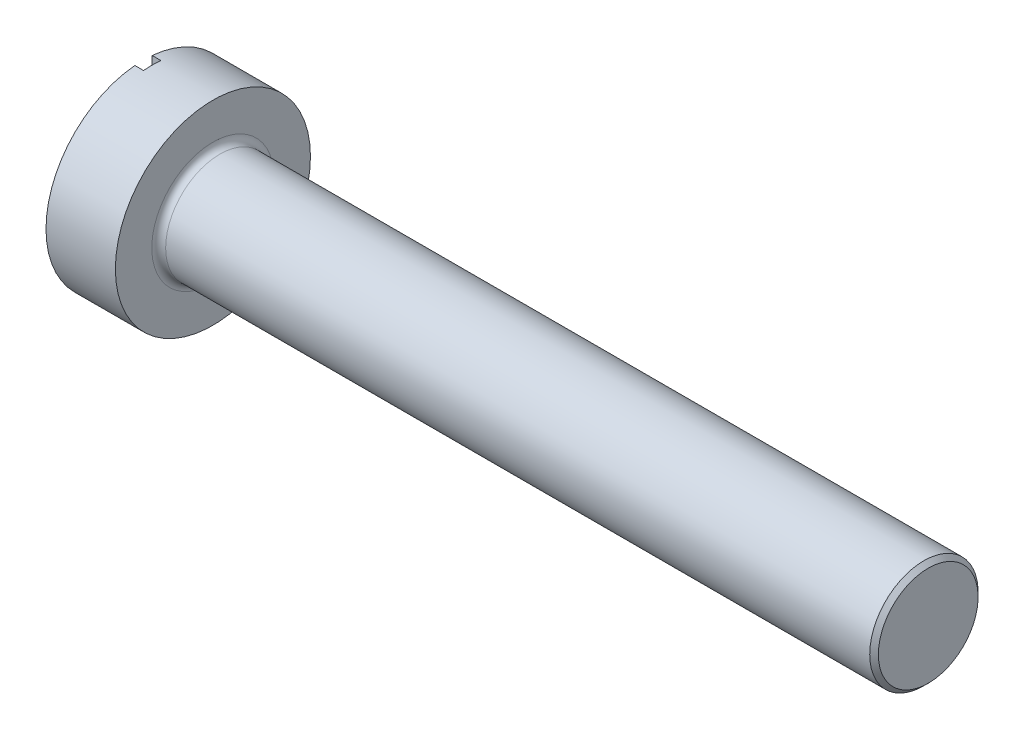
ISO-10303-21;
HEADER;
FILE_DESCRIPTION(('STEP AP214'),'2;1');
FILE_NAME('part.step','',(''),(''),'','','');
FILE_SCHEMA(('AUTOMOTIVE_DESIGN { 1 0 10303 214 1 1 1 1 }'));
ENDSEC;
DATA;
#1=APPLICATION_CONTEXT('core data for automotive mechanical design processes');
#2=APPLICATION_PROTOCOL_DEFINITION('international standard','automotive_design',2000,#1);
#3=PRODUCT_CONTEXT('',#1,'mechanical');
#4=PRODUCT('Part','Part','',(#3));
#5=PRODUCT_RELATED_PRODUCT_CATEGORY('part','',(#4));
#6=PRODUCT_DEFINITION_FORMATION('','',#4);
#7=PRODUCT_DEFINITION_CONTEXT('part definition',#1,'design');
#8=PRODUCT_DEFINITION('design','',#6,#7);
#9=PRODUCT_DEFINITION_SHAPE('','',#8);
#10=(LENGTH_UNIT() NAMED_UNIT(*) SI_UNIT(.MILLI.,.METRE.));
#11=(NAMED_UNIT(*) PLANE_ANGLE_UNIT() SI_UNIT($,.RADIAN.));
#12=(NAMED_UNIT(*) SI_UNIT($,.STERADIAN.) SOLID_ANGLE_UNIT());
#13=UNCERTAINTY_MEASURE_WITH_UNIT(LENGTH_MEASURE(1.E-05),#10,'distance_accuracy_value','');
#14=(GEOMETRIC_REPRESENTATION_CONTEXT(3) GLOBAL_UNCERTAINTY_ASSIGNED_CONTEXT((#13)) GLOBAL_UNIT_ASSIGNED_CONTEXT((#10,
#11,#12)) REPRESENTATION_CONTEXT('',''));
#15=CARTESIAN_POINT('',(0.,0.,0.));
#16=DIRECTION('',(0.,0.,1.));
#17=DIRECTION('',(1.,0.,0.));
#18=AXIS2_PLACEMENT_3D('',#15,#16,#17);
#19=CARTESIAN_POINT('',(0.,0.,0.));
#20=DIRECTION('',(-1.,0.,0.));
#21=DIRECTION('',(0.,0.,1.));
#22=AXIS2_PLACEMENT_3D('',#19,#20,#21);
#23=CYLINDRICAL_SURFACE('',#22,2.25);
#24=CARTESIAN_POINT('',(1.6,0.,0.));
#25=DIRECTION('',(-1.,0.,0.));
#26=DIRECTION('',(0.,0.,1.));
#27=AXIS2_PLACEMENT_3D('',#24,#25,#26);
#28=CIRCLE('',#27,2.25);
#29=CARTESIAN_POINT('',(1.6,0.,2.25));
#30=VERTEX_POINT('',#29);
#31=EDGE_CURVE('E92',#30,#30,#28,.T.);
#32=ORIENTED_EDGE('',*,*,#31,.T.);
#33=EDGE_LOOP('',(#32));
#34=FACE_BOUND('',#33,.T.);
#35=DIRECTION('',(-1.,0.,0.));
#36=VECTOR('',#35,1.);
#37=CARTESIAN_POINT('',(0.,-2.2410934831015,0.2));
#38=LINE('',#37,#36);
#39=CARTESIAN_POINT('',(0.2,-2.2410934831015,0.2));
#40=VERTEX_POINT('',#39);
#41=CARTESIAN_POINT('',(0.,-2.2410934831015,0.2));
#42=VERTEX_POINT('',#41);
#43=EDGE_CURVE('E122',#40,#42,#38,.T.);
#44=ORIENTED_EDGE('',*,*,#43,.F.);
#45=CARTESIAN_POINT('',(0.2,0.,0.));
#46=DIRECTION('',(-1.,0.,0.));
#47=DIRECTION('',(0.,0.,1.));
#48=AXIS2_PLACEMENT_3D('',#45,#46,#47);
#49=CIRCLE('',#48,2.25);
#50=CARTESIAN_POINT('',(0.2,-2.2410934831015,-0.2));
#51=VERTEX_POINT('',#50);
#52=EDGE_CURVE('E11',#40,#51,#49,.F.);
#53=ORIENTED_EDGE('',*,*,#52,.T.);
#54=DIRECTION('',(-1.,0.,0.));
#55=VECTOR('',#54,1.);
#56=CARTESIAN_POINT('',(0.,-2.2410934831015,-0.2));
#57=LINE('',#56,#55);
#58=CARTESIAN_POINT('',(0.,-2.2410934831015,-0.2));
#59=VERTEX_POINT('',#58);
#60=EDGE_CURVE('E79',#51,#59,#57,.T.);
#61=ORIENTED_EDGE('',*,*,#60,.T.);
#62=CARTESIAN_POINT('',(0.,0.,0.));
#63=DIRECTION('',(-1.,0.,0.));
#64=DIRECTION('',(0.,0.,1.));
#65=AXIS2_PLACEMENT_3D('',#62,#63,#64);
#66=CIRCLE('',#65,2.25);
#67=CARTESIAN_POINT('',(0.,2.2410934831015,-0.2));
#68=VERTEX_POINT('',#67);
#69=EDGE_CURVE('E88',#68,#59,#66,.T.);
#70=ORIENTED_EDGE('',*,*,#69,.F.);
#71=DIRECTION('',(-1.,0.,0.));
#72=VECTOR('',#71,1.);
#73=CARTESIAN_POINT('',(0.,2.2410934831015,-0.2));
#74=LINE('',#73,#72);
#75=CARTESIAN_POINT('',(0.2,2.2410934831015,-0.2));
#76=VERTEX_POINT('',#75);
#77=EDGE_CURVE('E52',#68,#76,#74,.F.);
#78=ORIENTED_EDGE('',*,*,#77,.T.);
#79=CARTESIAN_POINT('',(0.2,2.2410934831015,0.2));
#80=VERTEX_POINT('',#79);
#81=EDGE_CURVE('E41',#76,#80,#49,.F.);
#82=ORIENTED_EDGE('',*,*,#81,.T.);
#83=DIRECTION('',(-1.,0.,0.));
#84=VECTOR('',#83,1.);
#85=CARTESIAN_POINT('',(0.,2.2410934831015,0.2));
#86=LINE('',#85,#84);
#87=CARTESIAN_POINT('',(0.,2.2410934831015,0.2));
#88=VERTEX_POINT('',#87);
#89=EDGE_CURVE('E99',#88,#80,#86,.F.);
#90=ORIENTED_EDGE('',*,*,#89,.F.);
#91=EDGE_CURVE('E93',#42,#88,#66,.T.);
#92=ORIENTED_EDGE('',*,*,#91,.F.);
#93=EDGE_LOOP('',(#44,#53,#61,#70,#78,#82,#90,#92));
#94=FACE_BOUND('',#93,.T.);
#95=ADVANCED_FACE('F37',(#34,#94),#23,.T.);
#96=CARTESIAN_POINT('',(0.,0.,0.));
#97=DIRECTION('',(-1.,0.,0.));
#98=DIRECTION('',(0.,0.,1.));
#99=AXIS2_PLACEMENT_3D('',#96,#97,#98);
#100=PLANE('',#99);
#101=ORIENTED_EDGE('',*,*,#69,.T.);
#102=DIRECTION('',(0.,1.,0.));
#103=VECTOR('',#102,1.);
#104=CARTESIAN_POINT('',(0.,0.,-0.2));
#105=LINE('',#104,#103);
#106=EDGE_CURVE('E76',#59,#68,#105,.T.);
#107=ORIENTED_EDGE('',*,*,#106,.T.);
#108=EDGE_LOOP('',(#101,#107));
#109=FACE_BOUND('',#108,.T.);
#110=ADVANCED_FACE('F91',(#109),#100,.T.);
#111=CARTESIAN_POINT('',(18.1,0.,0.));
#112=DIRECTION('',(-1.,0.,0.));
#113=DIRECTION('',(0.,0.,1.));
#114=AXIS2_PLACEMENT_3D('',#111,#112,#113);
#115=PLANE('',#114);
#116=CARTESIAN_POINT('',(18.1,0.,0.));
#117=DIRECTION('',(-1.,0.,0.));
#118=DIRECTION('',(0.,0.,1.));
#119=AXIS2_PLACEMENT_3D('',#116,#117,#118);
#120=CIRCLE('',#119,1.14999999999999);
#121=CARTESIAN_POINT('',(18.1,0.,1.14999999999999));
#122=VERTEX_POINT('',#121);
#123=EDGE_CURVE('E105',#122,#122,#120,.F.);
#124=ORIENTED_EDGE('',*,*,#123,.T.);
#125=EDGE_LOOP('',(#124));
#126=FACE_BOUND('',#125,.T.);
#127=ADVANCED_FACE('F141',(#126),#115,.F.);
#128=CARTESIAN_POINT('',(0.,0.,0.));
#129=DIRECTION('',(-1.,0.,0.));
#130=DIRECTION('',(0.,0.,1.));
#131=AXIS2_PLACEMENT_3D('',#128,#129,#130);
#132=CYLINDRICAL_SURFACE('',#131,1.25);
#133=CARTESIAN_POINT('',(1.76,0.,0.));
#134=DIRECTION('',(1.,0.,0.));
#135=DIRECTION('',(0.,0.,-1.));
#136=AXIS2_PLACEMENT_3D('',#133,#134,#135);
#137=CIRCLE('',#136,1.25);
#138=CARTESIAN_POINT('',(1.76,0.,-1.25));
#139=VERTEX_POINT('',#138);
#140=EDGE_CURVE('E84',#139,#139,#137,.T.);
#141=ORIENTED_EDGE('',*,*,#140,.T.);
#142=EDGE_LOOP('',(#141));
#143=FACE_BOUND('',#142,.T.);
#144=CARTESIAN_POINT('',(18.,0.,0.));
#145=DIRECTION('',(-1.,0.,0.));
#146=DIRECTION('',(0.,0.,1.));
#147=AXIS2_PLACEMENT_3D('',#144,#145,#146);
#148=CIRCLE('',#147,1.25);
#149=CARTESIAN_POINT('',(18.,0.,1.25));
#150=VERTEX_POINT('',#149);
#151=EDGE_CURVE('E96',#150,#150,#148,.T.);
#152=ORIENTED_EDGE('',*,*,#151,.T.);
#153=EDGE_LOOP('',(#152));
#154=FACE_BOUND('',#153,.T.);
#155=ADVANCED_FACE('F135',(#143,#154),#132,.T.);
#156=CARTESIAN_POINT('',(1.6,0.,0.));
#157=DIRECTION('',(1.,0.,0.));
#158=DIRECTION('',(0.,0.,-1.));
#159=AXIS2_PLACEMENT_3D('',#156,#157,#158);
#160=PLANE('',#159);
#161=CARTESIAN_POINT('',(1.6,0.,0.));
#162=DIRECTION('',(1.,0.,0.));
#163=DIRECTION('',(0.,0.,-1.));
#164=AXIS2_PLACEMENT_3D('',#161,#162,#163);
#165=CIRCLE('',#164,1.41);
#166=CARTESIAN_POINT('',(1.6,0.,-1.41));
#167=VERTEX_POINT('',#166);
#168=EDGE_CURVE('E108',#167,#167,#165,.F.);
#169=ORIENTED_EDGE('',*,*,#168,.T.);
#170=EDGE_LOOP('',(#169));
#171=FACE_BOUND('',#170,.T.);
#172=ORIENTED_EDGE('',*,*,#31,.F.);
#173=EDGE_LOOP('',(#172));
#174=FACE_BOUND('',#173,.T.);
#175=ADVANCED_FACE('F128',(#171,#174),#160,.T.);
#176=DIRECTION('',(0.,1.,0.));
#177=VECTOR('',#176,1.);
#178=CARTESIAN_POINT('',(0.,0.,0.2));
#179=LINE('',#178,#177);
#180=EDGE_CURVE('E60',#42,#88,#179,.T.);
#181=ORIENTED_EDGE('',*,*,#180,.F.);
#182=ORIENTED_EDGE('',*,*,#91,.T.);
#183=EDGE_LOOP('',(#181,#182));
#184=FACE_BOUND('',#183,.T.);
#185=ADVANCED_FACE('F125',(#184),#100,.T.);
#186=CARTESIAN_POINT('',(18.,0.,0.));
#187=DIRECTION('',(-1.,0.,0.));
#188=DIRECTION('',(0.,0.,1.));
#189=AXIS2_PLACEMENT_3D('',#186,#187,#188);
#190=CONICAL_SURFACE('',#189,1.25,0.785398163397431);
#191=ORIENTED_EDGE('',*,*,#123,.F.);
#192=EDGE_LOOP('',(#191));
#193=FACE_BOUND('',#192,.T.);
#194=ORIENTED_EDGE('',*,*,#151,.F.);
#195=EDGE_LOOP('',(#194));
#196=FACE_BOUND('',#195,.T.);
#197=ADVANCED_FACE('F127',(#193,#196),#190,.T.);
#198=CARTESIAN_POINT('',(1.76,0.,0.));
#199=DIRECTION('',(1.,0.,0.));
#200=DIRECTION('',(0.,0.,-1.));
#201=AXIS2_PLACEMENT_3D('',#198,#199,#200);
#202=TOROIDAL_SURFACE('',#201,1.41,0.16);
#203=ORIENTED_EDGE('',*,*,#140,.F.);
#204=EDGE_LOOP('',(#203));
#205=FACE_BOUND('',#204,.T.);
#206=ORIENTED_EDGE('',*,*,#168,.F.);
#207=EDGE_LOOP('',(#206));
#208=FACE_BOUND('',#207,.T.);
#209=ADVANCED_FACE('F39',(#205,#208),#202,.F.);
#210=CARTESIAN_POINT('',(0.2,-2.25,0.));
#211=DIRECTION('',(-1.,0.,0.));
#212=DIRECTION('',(0.,0.,1.));
#213=AXIS2_PLACEMENT_3D('',#210,#211,#212);
#214=PLANE('',#213);
#215=DIRECTION('',(0.,1.,0.));
#216=VECTOR('',#215,1.);
#217=CARTESIAN_POINT('',(0.2,-2.25,0.2));
#218=LINE('',#217,#216);
#219=EDGE_CURVE('E89',#40,#80,#218,.T.);
#220=ORIENTED_EDGE('',*,*,#219,.T.);
#221=ORIENTED_EDGE('',*,*,#81,.F.);
#222=DIRECTION('',(0.,1.,0.));
#223=VECTOR('',#222,1.);
#224=CARTESIAN_POINT('',(0.2,-2.25,-0.2));
#225=LINE('',#224,#223);
#226=EDGE_CURVE('E117',#51,#76,#225,.T.);
#227=ORIENTED_EDGE('',*,*,#226,.F.);
#228=ORIENTED_EDGE('',*,*,#52,.F.);
#229=EDGE_LOOP('',(#220,#221,#227,#228));
#230=FACE_BOUND('',#229,.T.);
#231=ADVANCED_FACE('F116',(#230),#214,.T.);
#232=CARTESIAN_POINT('',(0.,-2.25,0.2));
#233=DIRECTION('',(0.,0.,1.));
#234=DIRECTION('',(1.,0.,0.));
#235=AXIS2_PLACEMENT_3D('',#232,#233,#234);
#236=PLANE('',#235);
#237=ORIENTED_EDGE('',*,*,#89,.T.);
#238=ORIENTED_EDGE('',*,*,#219,.F.);
#239=ORIENTED_EDGE('',*,*,#43,.T.);
#240=ORIENTED_EDGE('',*,*,#180,.T.);
#241=EDGE_LOOP('',(#237,#238,#239,#240));
#242=FACE_BOUND('',#241,.T.);
#243=ADVANCED_FACE('F123',(#242),#236,.F.);
#244=CARTESIAN_POINT('',(0.,-2.25,-0.2));
#245=DIRECTION('',(0.,0.,1.));
#246=DIRECTION('',(1.,0.,0.));
#247=AXIS2_PLACEMENT_3D('',#244,#245,#246);
#248=PLANE('',#247);
#249=ORIENTED_EDGE('',*,*,#106,.F.);
#250=ORIENTED_EDGE('',*,*,#60,.F.);
#251=ORIENTED_EDGE('',*,*,#226,.T.);
#252=ORIENTED_EDGE('',*,*,#77,.F.);
#253=EDGE_LOOP('',(#249,#250,#251,#252));
#254=FACE_BOUND('',#253,.T.);
#255=ADVANCED_FACE('F78',(#254),#248,.T.);
#256=CLOSED_SHELL('',(#95,#110,#127,#155,#175,#185,#197,#209,#231,#243,#255));
#257=MANIFOLD_SOLID_BREP('B2',#256);
#258=ADVANCED_BREP_SHAPE_REPRESENTATION('',(#18,#257),#14);
#259=SHAPE_DEFINITION_REPRESENTATION(#9,#258);
ENDSEC;
END-ISO-10303-21;
